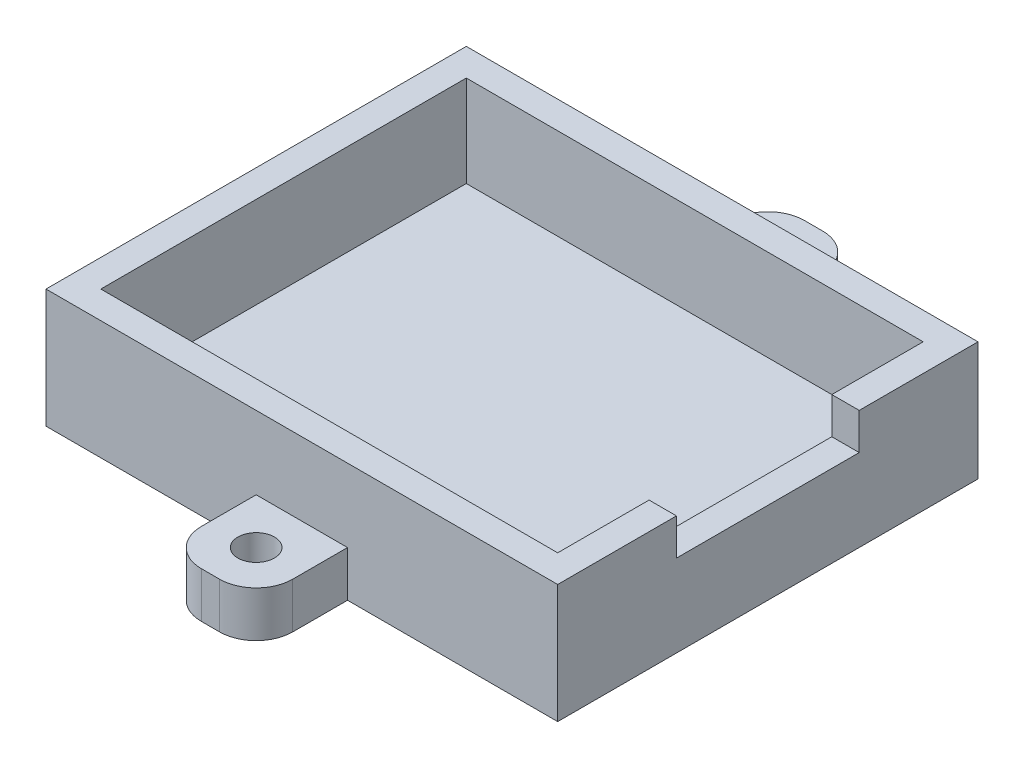
ISO-10303-21;
HEADER;
FILE_DESCRIPTION(('STEP AP214'),'2;1');
FILE_NAME('part.step','',(''),(''),'','','');
FILE_SCHEMA(('AUTOMOTIVE_DESIGN { 1 0 10303 214 1 1 1 1 }'));
ENDSEC;
DATA;
#1=APPLICATION_CONTEXT('core data for automotive mechanical design processes');
#2=APPLICATION_PROTOCOL_DEFINITION('international standard','automotive_design',2000,#1);
#3=PRODUCT_CONTEXT('',#1,'mechanical');
#4=PRODUCT('Part','Part','',(#3));
#5=PRODUCT_RELATED_PRODUCT_CATEGORY('part','',(#4));
#6=PRODUCT_DEFINITION_FORMATION('','',#4);
#7=PRODUCT_DEFINITION_CONTEXT('part definition',#1,'design');
#8=PRODUCT_DEFINITION('design','',#6,#7);
#9=PRODUCT_DEFINITION_SHAPE('','',#8);
#10=(LENGTH_UNIT() NAMED_UNIT(*) SI_UNIT(.MILLI.,.METRE.));
#11=(NAMED_UNIT(*) PLANE_ANGLE_UNIT() SI_UNIT($,.RADIAN.));
#12=(NAMED_UNIT(*) SI_UNIT($,.STERADIAN.) SOLID_ANGLE_UNIT());
#13=UNCERTAINTY_MEASURE_WITH_UNIT(LENGTH_MEASURE(1.E-05),#10,'distance_accuracy_value','');
#14=(GEOMETRIC_REPRESENTATION_CONTEXT(3) GLOBAL_UNCERTAINTY_ASSIGNED_CONTEXT((#13)) GLOBAL_UNIT_ASSIGNED_CONTEXT((#10,
#11,#12)) REPRESENTATION_CONTEXT('',''));
#15=CARTESIAN_POINT('',(0.,0.,0.));
#16=DIRECTION('',(0.,0.,1.));
#17=DIRECTION('',(1.,0.,0.));
#18=AXIS2_PLACEMENT_3D('',#15,#16,#17);
#19=CARTESIAN_POINT('',(0.,1.5,0.));
#20=DIRECTION('',(1.,0.,0.));
#21=DIRECTION('',(0.,0.,-1.));
#22=AXIS2_PLACEMENT_3D('',#19,#20,#21);
#23=PLANE('',#22);
#24=DIRECTION('',(0.,0.,1.));
#25=VECTOR('',#24,1.);
#26=CARTESIAN_POINT('',(0.,0.,0.));
#27=LINE('',#26,#25);
#28=CARTESIAN_POINT('',(0.,0.,0.));
#29=VERTEX_POINT('',#28);
#30=CARTESIAN_POINT('',(0.,0.,23.));
#31=VERTEX_POINT('',#30);
#32=EDGE_CURVE('E207',#29,#31,#27,.T.);
#33=ORIENTED_EDGE('',*,*,#32,.T.);
#34=DIRECTION('',(0.,-1.,0.));
#35=VECTOR('',#34,1.);
#36=CARTESIAN_POINT('',(0.,1.5,23.));
#37=LINE('',#36,#35);
#38=CARTESIAN_POINT('',(0.,6.5,23.));
#39=VERTEX_POINT('',#38);
#40=EDGE_CURVE('E324',#39,#31,#37,.T.);
#41=ORIENTED_EDGE('',*,*,#40,.F.);
#42=DIRECTION('',(0.,0.,1.));
#43=VECTOR('',#42,1.);
#44=CARTESIAN_POINT('',(0.,6.5,23.));
#45=LINE('',#44,#43);
#46=CARTESIAN_POINT('',(0.,6.5,0.));
#47=VERTEX_POINT('',#46);
#48=EDGE_CURVE('E296',#47,#39,#45,.T.);
#49=ORIENTED_EDGE('',*,*,#48,.F.);
#50=DIRECTION('',(0.,-1.,0.));
#51=VECTOR('',#50,1.);
#52=CARTESIAN_POINT('',(0.,1.5,0.));
#53=LINE('',#52,#51);
#54=EDGE_CURVE('E316',#47,#29,#53,.T.);
#55=ORIENTED_EDGE('',*,*,#54,.T.);
#56=EDGE_LOOP('',(#33,#41,#49,#55));
#57=FACE_BOUND('',#56,.T.);
#58=ADVANCED_FACE('F35',(#57),#23,.F.);
#59=CARTESIAN_POINT('',(0.,1.5,23.));
#60=DIRECTION('',(0.,0.,-1.));
#61=DIRECTION('',(-1.,0.,0.));
#62=AXIS2_PLACEMENT_3D('',#59,#60,#61);
#63=PLANE('',#62);
#64=DIRECTION('',(1.,0.,0.));
#65=VECTOR('',#64,1.);
#66=CARTESIAN_POINT('',(0.,0.,23.));
#67=LINE('',#66,#65);
#68=CARTESIAN_POINT('',(11.5,0.,23.));
#69=VERTEX_POINT('',#68);
#70=EDGE_CURVE('E206',#31,#69,#67,.T.);
#71=ORIENTED_EDGE('',*,*,#70,.T.);
#72=DIRECTION('',(0.,1.,0.));
#73=VECTOR('',#72,1.);
#74=CARTESIAN_POINT('',(11.5,1.5,23.));
#75=LINE('',#74,#73);
#76=CARTESIAN_POINT('',(11.5,2.5,23.));
#77=VERTEX_POINT('',#76);
#78=EDGE_CURVE('E242',#69,#77,#75,.T.);
#79=ORIENTED_EDGE('',*,*,#78,.T.);
#80=DIRECTION('',(-1.,0.,0.));
#81=VECTOR('',#80,1.);
#82=CARTESIAN_POINT('',(0.,2.5,23.));
#83=LINE('',#82,#81);
#84=CARTESIAN_POINT('',(16.5,2.5,23.));
#85=VERTEX_POINT('',#84);
#86=EDGE_CURVE('E215',#85,#77,#83,.T.);
#87=ORIENTED_EDGE('',*,*,#86,.F.);
#88=DIRECTION('',(0.,-1.,0.));
#89=VECTOR('',#88,1.);
#90=CARTESIAN_POINT('',(16.5,1.5,23.));
#91=LINE('',#90,#89);
#92=CARTESIAN_POINT('',(16.5,0.,23.));
#93=VERTEX_POINT('',#92);
#94=EDGE_CURVE('E210',#85,#93,#91,.T.);
#95=ORIENTED_EDGE('',*,*,#94,.T.);
#96=CARTESIAN_POINT('',(28.,0.,23.));
#97=VERTEX_POINT('',#96);
#98=EDGE_CURVE('E196',#93,#97,#67,.T.);
#99=ORIENTED_EDGE('',*,*,#98,.T.);
#100=DIRECTION('',(0.,-1.,0.));
#101=VECTOR('',#100,1.);
#102=CARTESIAN_POINT('',(28.,1.5,23.));
#103=LINE('',#102,#101);
#104=CARTESIAN_POINT('',(28.,6.5,23.));
#105=VERTEX_POINT('',#104);
#106=EDGE_CURVE('E322',#105,#97,#103,.T.);
#107=ORIENTED_EDGE('',*,*,#106,.F.);
#108=DIRECTION('',(1.,0.,0.));
#109=VECTOR('',#108,1.);
#110=CARTESIAN_POINT('',(0.,6.5,23.));
#111=LINE('',#110,#109);
#112=EDGE_CURVE('E299',#39,#105,#111,.T.);
#113=ORIENTED_EDGE('',*,*,#112,.F.);
#114=ORIENTED_EDGE('',*,*,#40,.T.);
#115=EDGE_LOOP('',(#71,#79,#87,#95,#99,#107,#113,#114));
#116=FACE_BOUND('',#115,.T.);
#117=ADVANCED_FACE('F212',(#116),#63,.F.);
#118=CARTESIAN_POINT('',(28.,1.5,0.));
#119=DIRECTION('',(-1.,0.,0.));
#120=DIRECTION('',(0.,0.,1.));
#121=AXIS2_PLACEMENT_3D('',#118,#119,#120);
#122=PLANE('',#121);
#123=DIRECTION('',(0.,0.,-1.));
#124=VECTOR('',#123,1.);
#125=CARTESIAN_POINT('',(28.,4.5,16.5));
#126=LINE('',#125,#124);
#127=CARTESIAN_POINT('',(28.,4.5,16.5));
#128=VERTEX_POINT('',#127);
#129=CARTESIAN_POINT('',(28.,4.5,6.5));
#130=VERTEX_POINT('',#129);
#131=EDGE_CURVE('E251',#128,#130,#126,.T.);
#132=ORIENTED_EDGE('',*,*,#131,.F.);
#133=DIRECTION('',(0.,-1.,0.));
#134=VECTOR('',#133,1.);
#135=CARTESIAN_POINT('',(28.,6.5,16.5));
#136=LINE('',#135,#134);
#137=CARTESIAN_POINT('',(28.,6.5,16.5));
#138=VERTEX_POINT('',#137);
#139=EDGE_CURVE('E248',#138,#128,#136,.T.);
#140=ORIENTED_EDGE('',*,*,#139,.F.);
#141=DIRECTION('',(0.,0.,-1.));
#142=VECTOR('',#141,1.);
#143=CARTESIAN_POINT('',(28.,6.5,23.));
#144=LINE('',#143,#142);
#145=EDGE_CURVE('E303',#105,#138,#144,.T.);
#146=ORIENTED_EDGE('',*,*,#145,.F.);
#147=ORIENTED_EDGE('',*,*,#106,.T.);
#148=DIRECTION('',(0.,0.,-1.));
#149=VECTOR('',#148,1.);
#150=CARTESIAN_POINT('',(28.,0.,0.));
#151=LINE('',#150,#149);
#152=CARTESIAN_POINT('',(28.,0.,0.));
#153=VERTEX_POINT('',#152);
#154=EDGE_CURVE('E203',#97,#153,#151,.T.);
#155=ORIENTED_EDGE('',*,*,#154,.T.);
#156=DIRECTION('',(0.,-1.,0.));
#157=VECTOR('',#156,1.);
#158=CARTESIAN_POINT('',(28.,1.5,0.));
#159=LINE('',#158,#157);
#160=CARTESIAN_POINT('',(28.,6.5,0.));
#161=VERTEX_POINT('',#160);
#162=EDGE_CURVE('E319',#161,#153,#159,.T.);
#163=ORIENTED_EDGE('',*,*,#162,.F.);
#164=CARTESIAN_POINT('',(28.,6.5,6.5));
#165=VERTEX_POINT('',#164);
#166=EDGE_CURVE('E302',#165,#161,#144,.T.);
#167=ORIENTED_EDGE('',*,*,#166,.F.);
#168=DIRECTION('',(0.,1.,0.));
#169=VECTOR('',#168,1.);
#170=CARTESIAN_POINT('',(28.,6.5,6.5));
#171=LINE('',#170,#169);
#172=EDGE_CURVE('E254',#130,#165,#171,.T.);
#173=ORIENTED_EDGE('',*,*,#172,.F.);
#174=EDGE_LOOP('',(#132,#140,#146,#147,#155,#163,#167,#173));
#175=FACE_BOUND('',#174,.T.);
#176=ADVANCED_FACE('F432',(#175),#122,.F.);
#177=CARTESIAN_POINT('',(0.,1.5,0.));
#178=DIRECTION('',(0.,0.,1.));
#179=DIRECTION('',(1.,0.,0.));
#180=AXIS2_PLACEMENT_3D('',#177,#178,#179);
#181=PLANE('',#180);
#182=DIRECTION('',(1.,0.,0.));
#183=VECTOR('',#182,1.);
#184=CARTESIAN_POINT('',(0.,2.5,0.));
#185=LINE('',#184,#183);
#186=CARTESIAN_POINT('',(11.5,2.5,0.));
#187=VERTEX_POINT('',#186);
#188=CARTESIAN_POINT('',(16.5,2.5,0.));
#189=VERTEX_POINT('',#188);
#190=EDGE_CURVE('E244',#187,#189,#185,.T.);
#191=ORIENTED_EDGE('',*,*,#190,.F.);
#192=DIRECTION('',(0.,-1.,0.));
#193=VECTOR('',#192,1.);
#194=CARTESIAN_POINT('',(11.5,1.5,0.));
#195=LINE('',#194,#193);
#196=CARTESIAN_POINT('',(11.5,0.,0.));
#197=VERTEX_POINT('',#196);
#198=EDGE_CURVE('E219',#187,#197,#195,.T.);
#199=ORIENTED_EDGE('',*,*,#198,.T.);
#200=DIRECTION('',(-1.,0.,0.));
#201=VECTOR('',#200,1.);
#202=CARTESIAN_POINT('',(0.,0.,0.));
#203=LINE('',#202,#201);
#204=EDGE_CURVE('E312',#197,#29,#203,.T.);
#205=ORIENTED_EDGE('',*,*,#204,.T.);
#206=ORIENTED_EDGE('',*,*,#54,.F.);
#207=DIRECTION('',(-1.,0.,0.));
#208=VECTOR('',#207,1.);
#209=CARTESIAN_POINT('',(0.,6.5,0.));
#210=LINE('',#209,#208);
#211=EDGE_CURVE('E306',#161,#47,#210,.T.);
#212=ORIENTED_EDGE('',*,*,#211,.F.);
#213=ORIENTED_EDGE('',*,*,#162,.T.);
#214=CARTESIAN_POINT('',(16.5,0.,0.));
#215=VERTEX_POINT('',#214);
#216=EDGE_CURVE('E313',#153,#215,#203,.T.);
#217=ORIENTED_EDGE('',*,*,#216,.T.);
#218=DIRECTION('',(0.,1.,0.));
#219=VECTOR('',#218,1.);
#220=CARTESIAN_POINT('',(16.5,1.5,0.));
#221=LINE('',#220,#219);
#222=EDGE_CURVE('E220',#215,#189,#221,.T.);
#223=ORIENTED_EDGE('',*,*,#222,.T.);
#224=EDGE_LOOP('',(#191,#199,#205,#206,#212,#213,#217,#223));
#225=FACE_BOUND('',#224,.T.);
#226=ADVANCED_FACE('F556',(#225),#181,.F.);
#227=CARTESIAN_POINT('',(0.,0.,0.));
#228=DIRECTION('',(0.,1.,0.));
#229=DIRECTION('',(0.,0.,1.));
#230=AXIS2_PLACEMENT_3D('',#227,#228,#229);
#231=PLANE('',#230);
#232=CARTESIAN_POINT('',(14.,0.,25.5));
#233=DIRECTION('',(0.,1.,0.));
#234=DIRECTION('',(0.,0.,1.));
#235=AXIS2_PLACEMENT_3D('',#232,#233,#234);
#236=CIRCLE('',#235,1.);
#237=CARTESIAN_POINT('',(14.,0.,26.5));
#238=VERTEX_POINT('',#237);
#239=EDGE_CURVE('E390',#238,#238,#236,.T.);
#240=ORIENTED_EDGE('',*,*,#239,.T.);
#241=EDGE_LOOP('',(#240));
#242=FACE_BOUND('',#241,.T.);
#243=CARTESIAN_POINT('',(14.,0.,-2.5));
#244=DIRECTION('',(0.,1.,0.));
#245=DIRECTION('',(0.,0.,1.));
#246=AXIS2_PLACEMENT_3D('',#243,#244,#245);
#247=CIRCLE('',#246,1.);
#248=CARTESIAN_POINT('',(14.,0.,-1.5));
#249=VERTEX_POINT('',#248);
#250=EDGE_CURVE('E380',#249,#249,#247,.T.);
#251=ORIENTED_EDGE('',*,*,#250,.T.);
#252=EDGE_LOOP('',(#251));
#253=FACE_BOUND('',#252,.T.);
#254=DIRECTION('',(1.,0.,0.));
#255=VECTOR('',#254,1.);
#256=CARTESIAN_POINT('',(11.5,0.,-5.));
#257=LINE('',#256,#255);
#258=CARTESIAN_POINT('',(13.5,0.,-5.));
#259=VERTEX_POINT('',#258);
#260=CARTESIAN_POINT('',(14.5,0.,-5.));
#261=VERTEX_POINT('',#260);
#262=EDGE_CURVE('E227',#259,#261,#257,.T.);
#263=ORIENTED_EDGE('',*,*,#262,.T.);
#264=CARTESIAN_POINT('',(14.5,0.,-3.));
#265=DIRECTION('',(0.,1.,0.));
#266=DIRECTION('',(0.,0.,1.));
#267=AXIS2_PLACEMENT_3D('',#264,#265,#266);
#268=CIRCLE('',#267,2.);
#269=CARTESIAN_POINT('',(16.5,0.,-3.));
#270=VERTEX_POINT('',#269);
#271=EDGE_CURVE('E345',#261,#270,#268,.F.);
#272=ORIENTED_EDGE('',*,*,#271,.T.);
#273=DIRECTION('',(0.,0.,1.));
#274=VECTOR('',#273,1.);
#275=CARTESIAN_POINT('',(16.5,0.,28.));
#276=LINE('',#275,#274);
#277=EDGE_CURVE('E226',#270,#215,#276,.T.);
#278=ORIENTED_EDGE('',*,*,#277,.T.);
#279=ORIENTED_EDGE('',*,*,#216,.F.);
#280=ORIENTED_EDGE('',*,*,#154,.F.);
#281=ORIENTED_EDGE('',*,*,#98,.F.);
#282=CARTESIAN_POINT('',(16.5,0.,26.));
#283=VERTEX_POINT('',#282);
#284=EDGE_CURVE('E201',#93,#283,#276,.T.);
#285=ORIENTED_EDGE('',*,*,#284,.T.);
#286=CARTESIAN_POINT('',(14.5,0.,26.));
#287=DIRECTION('',(0.,1.,0.));
#288=DIRECTION('',(0.,0.,1.));
#289=AXIS2_PLACEMENT_3D('',#286,#287,#288);
#290=CIRCLE('',#289,2.);
#291=CARTESIAN_POINT('',(14.5,0.,28.));
#292=VERTEX_POINT('',#291);
#293=EDGE_CURVE('E341',#283,#292,#290,.F.);
#294=ORIENTED_EDGE('',*,*,#293,.T.);
#295=DIRECTION('',(-1.,0.,0.));
#296=VECTOR('',#295,1.);
#297=CARTESIAN_POINT('',(11.5,0.,28.));
#298=LINE('',#297,#296);
#299=CARTESIAN_POINT('',(13.5,0.,28.));
#300=VERTEX_POINT('',#299);
#301=EDGE_CURVE('E229',#292,#300,#298,.T.);
#302=ORIENTED_EDGE('',*,*,#301,.T.);
#303=CARTESIAN_POINT('',(13.5,0.,26.));
#304=DIRECTION('',(0.,1.,0.));
#305=DIRECTION('',(0.,0.,1.));
#306=AXIS2_PLACEMENT_3D('',#303,#304,#305);
#307=CIRCLE('',#306,2.);
#308=CARTESIAN_POINT('',(11.5,0.,26.));
#309=VERTEX_POINT('',#308);
#310=EDGE_CURVE('E339',#300,#309,#307,.F.);
#311=ORIENTED_EDGE('',*,*,#310,.T.);
#312=DIRECTION('',(0.,0.,-1.));
#313=VECTOR('',#312,1.);
#314=CARTESIAN_POINT('',(11.5,0.,28.));
#315=LINE('',#314,#313);
#316=EDGE_CURVE('E230',#309,#69,#315,.T.);
#317=ORIENTED_EDGE('',*,*,#316,.T.);
#318=ORIENTED_EDGE('',*,*,#70,.F.);
#319=ORIENTED_EDGE('',*,*,#32,.F.);
#320=ORIENTED_EDGE('',*,*,#204,.F.);
#321=CARTESIAN_POINT('',(11.5,0.,-3.));
#322=VERTEX_POINT('',#321);
#323=EDGE_CURVE('E378',#197,#322,#315,.T.);
#324=ORIENTED_EDGE('',*,*,#323,.T.);
#325=CARTESIAN_POINT('',(13.5,0.,-3.));
#326=DIRECTION('',(0.,1.,0.));
#327=DIRECTION('',(0.,0.,1.));
#328=AXIS2_PLACEMENT_3D('',#325,#326,#327);
#329=CIRCLE('',#328,2.);
#330=EDGE_CURVE('E343',#322,#259,#329,.F.);
#331=ORIENTED_EDGE('',*,*,#330,.T.);
#332=EDGE_LOOP('',(#263,#272,#278,#279,#280,#281,#285,#294,#302,#311,#317,#318,#319,#320,#324,#331));
#333=FACE_BOUND('',#332,.T.);
#334=ADVANCED_FACE('F199',(#242,#253,#333),#231,.F.);
#335=CARTESIAN_POINT('',(0.,6.5,0.));
#336=DIRECTION('',(0.,-1.,0.));
#337=DIRECTION('',(0.,0.,-1.));
#338=AXIS2_PLACEMENT_3D('',#335,#336,#337);
#339=PLANE('',#338);
#340=ORIENTED_EDGE('',*,*,#145,.T.);
#341=DIRECTION('',(1.,0.,0.));
#342=VECTOR('',#341,1.);
#343=CARTESIAN_POINT('',(26.,6.5,16.5));
#344=LINE('',#343,#342);
#345=CARTESIAN_POINT('',(26.5,6.5,16.5));
#346=VERTEX_POINT('',#345);
#347=EDGE_CURVE('E257',#346,#138,#344,.T.);
#348=ORIENTED_EDGE('',*,*,#347,.F.);
#349=DIRECTION('',(0.,0.,-1.));
#350=VECTOR('',#349,1.);
#351=CARTESIAN_POINT('',(26.5,6.5,21.5));
#352=LINE('',#351,#350);
#353=CARTESIAN_POINT('',(26.5,6.5,21.5));
#354=VERTEX_POINT('',#353);
#355=EDGE_CURVE('E270',#354,#346,#352,.T.);
#356=ORIENTED_EDGE('',*,*,#355,.F.);
#357=DIRECTION('',(1.,0.,0.));
#358=VECTOR('',#357,1.);
#359=CARTESIAN_POINT('',(1.50000000000001,6.5,21.5));
#360=LINE('',#359,#358);
#361=CARTESIAN_POINT('',(1.50000000000001,6.5,21.5));
#362=VERTEX_POINT('',#361);
#363=EDGE_CURVE('E266',#362,#354,#360,.T.);
#364=ORIENTED_EDGE('',*,*,#363,.F.);
#365=DIRECTION('',(0.,0.,1.));
#366=VECTOR('',#365,1.);
#367=CARTESIAN_POINT('',(1.50000000000001,6.5,21.5));
#368=LINE('',#367,#366);
#369=CARTESIAN_POINT('',(1.50000000000001,6.5,1.5));
#370=VERTEX_POINT('',#369);
#371=EDGE_CURVE('E276',#370,#362,#368,.T.);
#372=ORIENTED_EDGE('',*,*,#371,.F.);
#373=DIRECTION('',(-1.,0.,0.));
#374=VECTOR('',#373,1.);
#375=CARTESIAN_POINT('',(1.50000000000001,6.5,1.5));
#376=LINE('',#375,#374);
#377=CARTESIAN_POINT('',(26.5,6.5,1.5));
#378=VERTEX_POINT('',#377);
#379=EDGE_CURVE('E273',#378,#370,#376,.T.);
#380=ORIENTED_EDGE('',*,*,#379,.F.);
#381=CARTESIAN_POINT('',(26.5,6.5,6.5));
#382=VERTEX_POINT('',#381);
#383=EDGE_CURVE('E268',#382,#378,#352,.T.);
#384=ORIENTED_EDGE('',*,*,#383,.F.);
#385=DIRECTION('',(1.,0.,0.));
#386=VECTOR('',#385,1.);
#387=CARTESIAN_POINT('',(26.,6.5,6.5));
#388=LINE('',#387,#386);
#389=EDGE_CURVE('E260',#382,#165,#388,.T.);
#390=ORIENTED_EDGE('',*,*,#389,.T.);
#391=ORIENTED_EDGE('',*,*,#166,.T.);
#392=ORIENTED_EDGE('',*,*,#211,.T.);
#393=ORIENTED_EDGE('',*,*,#48,.T.);
#394=ORIENTED_EDGE('',*,*,#112,.T.);
#395=EDGE_LOOP('',(#340,#348,#356,#364,#372,#380,#384,#390,#391,#392,#393,#394));
#396=FACE_BOUND('',#395,.T.);
#397=ADVANCED_FACE('F548',(#396),#339,.F.);
#398=CARTESIAN_POINT('',(1.50000000000001,6.5,21.5));
#399=DIRECTION('',(0.,0.,-1.));
#400=DIRECTION('',(-1.,0.,0.));
#401=AXIS2_PLACEMENT_3D('',#398,#399,#400);
#402=PLANE('',#401);
#403=DIRECTION('',(0.,-1.,0.));
#404=VECTOR('',#403,1.);
#405=CARTESIAN_POINT('',(26.5,6.5,21.5));
#406=LINE('',#405,#404);
#407=CARTESIAN_POINT('',(26.5,1.5,21.5));
#408=VERTEX_POINT('',#407);
#409=EDGE_CURVE('E293',#354,#408,#406,.T.);
#410=ORIENTED_EDGE('',*,*,#409,.T.);
#411=DIRECTION('',(1.,0.,0.));
#412=VECTOR('',#411,1.);
#413=CARTESIAN_POINT('',(1.50000000000001,1.5,21.5));
#414=LINE('',#413,#412);
#415=CARTESIAN_POINT('',(1.50000000000001,1.5,21.5));
#416=VERTEX_POINT('',#415);
#417=EDGE_CURVE('E259',#416,#408,#414,.T.);
#418=ORIENTED_EDGE('',*,*,#417,.F.);
#419=DIRECTION('',(0.,-1.,0.));
#420=VECTOR('',#419,1.);
#421=CARTESIAN_POINT('',(1.50000000000001,6.5,21.5));
#422=LINE('',#421,#420);
#423=EDGE_CURVE('E278',#362,#416,#422,.T.);
#424=ORIENTED_EDGE('',*,*,#423,.F.);
#425=ORIENTED_EDGE('',*,*,#363,.T.);
#426=EDGE_LOOP('',(#410,#418,#424,#425));
#427=FACE_BOUND('',#426,.T.);
#428=ADVANCED_FACE('F545',(#427),#402,.T.);
#429=CARTESIAN_POINT('',(26.5,6.5,21.5));
#430=DIRECTION('',(-1.,0.,0.));
#431=DIRECTION('',(0.,0.,1.));
#432=AXIS2_PLACEMENT_3D('',#429,#430,#431);
#433=PLANE('',#432);
#434=DIRECTION('',(0.,1.,0.));
#435=VECTOR('',#434,1.);
#436=CARTESIAN_POINT('',(26.5,6.5,16.5));
#437=LINE('',#436,#435);
#438=CARTESIAN_POINT('',(26.5,4.5,16.5));
#439=VERTEX_POINT('',#438);
#440=EDGE_CURVE('E332',#439,#346,#437,.T.);
#441=ORIENTED_EDGE('',*,*,#440,.F.);
#442=DIRECTION('',(0.,0.,1.));
#443=VECTOR('',#442,1.);
#444=CARTESIAN_POINT('',(26.5,4.5,21.5));
#445=LINE('',#444,#443);
#446=CARTESIAN_POINT('',(26.5,4.5,6.5));
#447=VERTEX_POINT('',#446);
#448=EDGE_CURVE('E327',#447,#439,#445,.T.);
#449=ORIENTED_EDGE('',*,*,#448,.F.);
#450=DIRECTION('',(0.,-1.,0.));
#451=VECTOR('',#450,1.);
#452=CARTESIAN_POINT('',(26.5,6.5,6.5));
#453=LINE('',#452,#451);
#454=EDGE_CURVE('E329',#382,#447,#453,.T.);
#455=ORIENTED_EDGE('',*,*,#454,.F.);
#456=ORIENTED_EDGE('',*,*,#383,.T.);
#457=DIRECTION('',(0.,-1.,0.));
#458=VECTOR('',#457,1.);
#459=CARTESIAN_POINT('',(26.5,6.5,1.5));
#460=LINE('',#459,#458);
#461=CARTESIAN_POINT('',(26.5,1.5,1.5));
#462=VERTEX_POINT('',#461);
#463=EDGE_CURVE('E290',#378,#462,#460,.T.);
#464=ORIENTED_EDGE('',*,*,#463,.T.);
#465=DIRECTION('',(0.,0.,-1.));
#466=VECTOR('',#465,1.);
#467=CARTESIAN_POINT('',(26.5,1.5,21.5));
#468=LINE('',#467,#466);
#469=EDGE_CURVE('E280',#408,#462,#468,.T.);
#470=ORIENTED_EDGE('',*,*,#469,.F.);
#471=ORIENTED_EDGE('',*,*,#409,.F.);
#472=ORIENTED_EDGE('',*,*,#355,.T.);
#473=EDGE_LOOP('',(#441,#449,#455,#456,#464,#470,#471,#472));
#474=FACE_BOUND('',#473,.T.);
#475=ADVANCED_FACE('F539',(#474),#433,.T.);
#476=CARTESIAN_POINT('',(1.50000000000001,6.5,1.5));
#477=DIRECTION('',(0.,0.,1.));
#478=DIRECTION('',(1.,0.,0.));
#479=AXIS2_PLACEMENT_3D('',#476,#477,#478);
#480=PLANE('',#479);
#481=DIRECTION('',(0.,-1.,0.));
#482=VECTOR('',#481,1.);
#483=CARTESIAN_POINT('',(1.50000000000001,6.5,1.5));
#484=LINE('',#483,#482);
#485=CARTESIAN_POINT('',(1.50000000000001,1.5,1.5));
#486=VERTEX_POINT('',#485);
#487=EDGE_CURVE('E287',#370,#486,#484,.T.);
#488=ORIENTED_EDGE('',*,*,#487,.T.);
#489=DIRECTION('',(-1.,0.,0.));
#490=VECTOR('',#489,1.);
#491=CARTESIAN_POINT('',(1.50000000000001,1.5,1.5));
#492=LINE('',#491,#490);
#493=EDGE_CURVE('E282',#462,#486,#492,.T.);
#494=ORIENTED_EDGE('',*,*,#493,.F.);
#495=ORIENTED_EDGE('',*,*,#463,.F.);
#496=ORIENTED_EDGE('',*,*,#379,.T.);
#497=EDGE_LOOP('',(#488,#494,#495,#496));
#498=FACE_BOUND('',#497,.T.);
#499=ADVANCED_FACE('F536',(#498),#480,.T.);
#500=CARTESIAN_POINT('',(1.50000000000001,6.5,21.5));
#501=DIRECTION('',(1.,0.,0.));
#502=DIRECTION('',(0.,0.,-1.));
#503=AXIS2_PLACEMENT_3D('',#500,#501,#502);
#504=PLANE('',#503);
#505=DIRECTION('',(0.,0.,1.));
#506=VECTOR('',#505,1.);
#507=CARTESIAN_POINT('',(1.50000000000001,1.5,21.5));
#508=LINE('',#507,#506);
#509=EDGE_CURVE('E269',#486,#416,#508,.T.);
#510=ORIENTED_EDGE('',*,*,#509,.F.);
#511=ORIENTED_EDGE('',*,*,#487,.F.);
#512=ORIENTED_EDGE('',*,*,#371,.T.);
#513=ORIENTED_EDGE('',*,*,#423,.T.);
#514=EDGE_LOOP('',(#510,#511,#512,#513));
#515=FACE_BOUND('',#514,.T.);
#516=ADVANCED_FACE('F529',(#515),#504,.T.);
#517=CARTESIAN_POINT('',(0.,1.5,0.));
#518=DIRECTION('',(0.,1.,0.));
#519=DIRECTION('',(0.,0.,1.));
#520=AXIS2_PLACEMENT_3D('',#517,#518,#519);
#521=PLANE('',#520);
#522=ORIENTED_EDGE('',*,*,#493,.T.);
#523=ORIENTED_EDGE('',*,*,#509,.T.);
#524=ORIENTED_EDGE('',*,*,#417,.T.);
#525=ORIENTED_EDGE('',*,*,#469,.T.);
#526=EDGE_LOOP('',(#522,#523,#524,#525));
#527=FACE_BOUND('',#526,.T.);
#528=ADVANCED_FACE('F524',(#527),#521,.T.);
#529=CARTESIAN_POINT('',(26.,6.5,16.5));
#530=DIRECTION('',(0.,0.,1.));
#531=DIRECTION('',(1.,0.,0.));
#532=AXIS2_PLACEMENT_3D('',#529,#530,#531);
#533=PLANE('',#532);
#534=ORIENTED_EDGE('',*,*,#440,.T.);
#535=ORIENTED_EDGE('',*,*,#347,.T.);
#536=ORIENTED_EDGE('',*,*,#139,.T.);
#537=DIRECTION('',(1.,0.,0.));
#538=VECTOR('',#537,1.);
#539=CARTESIAN_POINT('',(26.,4.5,16.5));
#540=LINE('',#539,#538);
#541=EDGE_CURVE('E256',#439,#128,#540,.T.);
#542=ORIENTED_EDGE('',*,*,#541,.F.);
#543=EDGE_LOOP('',(#534,#535,#536,#542));
#544=FACE_BOUND('',#543,.T.);
#545=ADVANCED_FACE('F528',(#544),#533,.F.);
#546=CARTESIAN_POINT('',(26.,6.5,6.5));
#547=DIRECTION('',(0.,0.,-1.));
#548=DIRECTION('',(-1.,0.,0.));
#549=AXIS2_PLACEMENT_3D('',#546,#547,#548);
#550=PLANE('',#549);
#551=ORIENTED_EDGE('',*,*,#454,.T.);
#552=DIRECTION('',(1.,0.,0.));
#553=VECTOR('',#552,1.);
#554=CARTESIAN_POINT('',(26.,4.5,6.5));
#555=LINE('',#554,#553);
#556=EDGE_CURVE('E263',#447,#130,#555,.T.);
#557=ORIENTED_EDGE('',*,*,#556,.T.);
#558=ORIENTED_EDGE('',*,*,#172,.T.);
#559=ORIENTED_EDGE('',*,*,#389,.F.);
#560=EDGE_LOOP('',(#551,#557,#558,#559));
#561=FACE_BOUND('',#560,.T.);
#562=ADVANCED_FACE('F567',(#561),#550,.F.);
#563=CARTESIAN_POINT('',(26.,4.5,16.5));
#564=DIRECTION('',(0.,-1.,0.));
#565=DIRECTION('',(0.,0.,-1.));
#566=AXIS2_PLACEMENT_3D('',#563,#564,#565);
#567=PLANE('',#566);
#568=ORIENTED_EDGE('',*,*,#448,.T.);
#569=ORIENTED_EDGE('',*,*,#541,.T.);
#570=ORIENTED_EDGE('',*,*,#131,.T.);
#571=ORIENTED_EDGE('',*,*,#556,.F.);
#572=EDGE_LOOP('',(#568,#569,#570,#571));
#573=FACE_BOUND('',#572,.T.);
#574=ADVANCED_FACE('F516',(#573),#567,.F.);
#575=CARTESIAN_POINT('',(11.5,2.5,-5.));
#576=DIRECTION('',(0.,0.,-1.));
#577=DIRECTION('',(-1.,0.,0.));
#578=AXIS2_PLACEMENT_3D('',#575,#576,#577);
#579=PLANE('',#578);
#580=DIRECTION('',(1.,0.,0.));
#581=VECTOR('',#580,1.);
#582=CARTESIAN_POINT('',(11.5,2.5,-5.));
#583=LINE('',#582,#581);
#584=CARTESIAN_POINT('',(13.5,2.5,-5.));
#585=VERTEX_POINT('',#584);
#586=CARTESIAN_POINT('',(14.5,2.5,-5.));
#587=VERTEX_POINT('',#586);
#588=EDGE_CURVE('E368',#585,#587,#583,.T.);
#589=ORIENTED_EDGE('',*,*,#588,.T.);
#590=DIRECTION('',(0.,-1.,0.));
#591=VECTOR('',#590,1.);
#592=CARTESIAN_POINT('',(14.5,2.5,-5.));
#593=LINE('',#592,#591);
#594=EDGE_CURVE('E336',#587,#261,#593,.T.);
#595=ORIENTED_EDGE('',*,*,#594,.T.);
#596=ORIENTED_EDGE('',*,*,#262,.F.);
#597=DIRECTION('',(0.,-1.,0.));
#598=VECTOR('',#597,1.);
#599=CARTESIAN_POINT('',(13.5,2.5,-5.));
#600=LINE('',#599,#598);
#601=EDGE_CURVE('E334',#259,#585,#600,.F.);
#602=ORIENTED_EDGE('',*,*,#601,.T.);
#603=EDGE_LOOP('',(#589,#595,#596,#602));
#604=FACE_BOUND('',#603,.T.);
#605=ADVANCED_FACE('F423',(#604),#579,.T.);
#606=CARTESIAN_POINT('',(0.,2.5,0.));
#607=DIRECTION('',(0.,-1.,0.));
#608=DIRECTION('',(0.,0.,-1.));
#609=AXIS2_PLACEMENT_3D('',#606,#607,#608);
#610=PLANE('',#609);
#611=CARTESIAN_POINT('',(14.,2.5,-2.5));
#612=DIRECTION('',(0.,1.,0.));
#613=DIRECTION('',(0.,0.,1.));
#614=AXIS2_PLACEMENT_3D('',#611,#612,#613);
#615=CIRCLE('',#614,1.);
#616=CARTESIAN_POINT('',(14.,2.5,-1.5));
#617=VERTEX_POINT('',#616);
#618=EDGE_CURVE('E387',#617,#617,#615,.T.);
#619=ORIENTED_EDGE('',*,*,#618,.F.);
#620=EDGE_LOOP('',(#619));
#621=FACE_BOUND('',#620,.T.);
#622=DIRECTION('',(0.,0.,1.));
#623=VECTOR('',#622,1.);
#624=CARTESIAN_POINT('',(16.5,2.5,28.));
#625=LINE('',#624,#623);
#626=CARTESIAN_POINT('',(16.5,2.5,-3.));
#627=VERTEX_POINT('',#626);
#628=EDGE_CURVE('E367',#627,#189,#625,.T.);
#629=ORIENTED_EDGE('',*,*,#628,.F.);
#630=CARTESIAN_POINT('',(14.5,2.5,-3.));
#631=DIRECTION('',(0.,-1.,0.));
#632=DIRECTION('',(0.,0.,-1.));
#633=AXIS2_PLACEMENT_3D('',#630,#631,#632);
#634=CIRCLE('',#633,2.);
#635=EDGE_CURVE('E351',#627,#587,#634,.F.);
#636=ORIENTED_EDGE('',*,*,#635,.T.);
#637=ORIENTED_EDGE('',*,*,#588,.F.);
#638=CARTESIAN_POINT('',(13.5,2.5,-3.));
#639=DIRECTION('',(0.,-1.,0.));
#640=DIRECTION('',(0.,0.,-1.));
#641=AXIS2_PLACEMENT_3D('',#638,#639,#640);
#642=CIRCLE('',#641,2.);
#643=CARTESIAN_POINT('',(11.5,2.5,-3.));
#644=VERTEX_POINT('',#643);
#645=EDGE_CURVE('E349',#585,#644,#642,.F.);
#646=ORIENTED_EDGE('',*,*,#645,.T.);
#647=DIRECTION('',(0.,0.,-1.));
#648=VECTOR('',#647,1.);
#649=CARTESIAN_POINT('',(11.5,2.5,28.));
#650=LINE('',#649,#648);
#651=EDGE_CURVE('E236',#187,#644,#650,.T.);
#652=ORIENTED_EDGE('',*,*,#651,.F.);
#653=ORIENTED_EDGE('',*,*,#190,.T.);
#654=EDGE_LOOP('',(#629,#636,#637,#646,#652,#653));
#655=FACE_BOUND('',#654,.T.);
#656=ADVANCED_FACE('F412',(#621,#655),#610,.F.);
#657=CARTESIAN_POINT('',(16.5,2.5,28.));
#658=DIRECTION('',(1.,0.,0.));
#659=DIRECTION('',(0.,0.,-1.));
#660=AXIS2_PLACEMENT_3D('',#657,#658,#659);
#661=PLANE('',#660);
#662=ORIENTED_EDGE('',*,*,#277,.F.);
#663=DIRECTION('',(0.,-1.,0.));
#664=VECTOR('',#663,1.);
#665=CARTESIAN_POINT('',(16.5,2.5,-3.));
#666=LINE('',#665,#664);
#667=EDGE_CURVE('E347',#270,#627,#666,.F.);
#668=ORIENTED_EDGE('',*,*,#667,.T.);
#669=ORIENTED_EDGE('',*,*,#628,.T.);
#670=ORIENTED_EDGE('',*,*,#222,.F.);
#671=EDGE_LOOP('',(#662,#668,#669,#670));
#672=FACE_BOUND('',#671,.T.);
#673=ADVANCED_FACE('F418',(#672),#661,.T.);
#674=CARTESIAN_POINT('',(11.5,2.5,28.));
#675=DIRECTION('',(-1.,0.,0.));
#676=DIRECTION('',(0.,0.,1.));
#677=AXIS2_PLACEMENT_3D('',#674,#675,#676);
#678=PLANE('',#677);
#679=ORIENTED_EDGE('',*,*,#651,.T.);
#680=DIRECTION('',(0.,-1.,0.));
#681=VECTOR('',#680,1.);
#682=CARTESIAN_POINT('',(11.5,2.5,-3.));
#683=LINE('',#682,#681);
#684=EDGE_CURVE('E353',#644,#322,#683,.T.);
#685=ORIENTED_EDGE('',*,*,#684,.T.);
#686=ORIENTED_EDGE('',*,*,#323,.F.);
#687=ORIENTED_EDGE('',*,*,#198,.F.);
#688=EDGE_LOOP('',(#679,#685,#686,#687));
#689=FACE_BOUND('',#688,.T.);
#690=ADVANCED_FACE('F410',(#689),#678,.T.);
#691=CARTESIAN_POINT('',(14.,2.5,25.5));
#692=DIRECTION('',(0.,1.,0.));
#693=DIRECTION('',(0.,0.,1.));
#694=AXIS2_PLACEMENT_3D('',#691,#692,#693);
#695=CIRCLE('',#694,1.);
#696=CARTESIAN_POINT('',(14.,2.5,26.5));
#697=VERTEX_POINT('',#696);
#698=EDGE_CURVE('E393',#697,#697,#695,.T.);
#699=ORIENTED_EDGE('',*,*,#698,.F.);
#700=EDGE_LOOP('',(#699));
#701=FACE_BOUND('',#700,.T.);
#702=DIRECTION('',(-1.,0.,0.));
#703=VECTOR('',#702,1.);
#704=CARTESIAN_POINT('',(11.5,2.5,28.));
#705=LINE('',#704,#703);
#706=CARTESIAN_POINT('',(14.5,2.5,28.));
#707=VERTEX_POINT('',#706);
#708=CARTESIAN_POINT('',(13.5,2.5,28.));
#709=VERTEX_POINT('',#708);
#710=EDGE_CURVE('E238',#707,#709,#705,.T.);
#711=ORIENTED_EDGE('',*,*,#710,.F.);
#712=CARTESIAN_POINT('',(14.5,2.5,26.));
#713=DIRECTION('',(0.,-1.,0.));
#714=DIRECTION('',(0.,0.,-1.));
#715=AXIS2_PLACEMENT_3D('',#712,#713,#714);
#716=CIRCLE('',#715,2.);
#717=CARTESIAN_POINT('',(16.5,2.5,26.));
#718=VERTEX_POINT('',#717);
#719=EDGE_CURVE('E43',#707,#718,#716,.F.);
#720=ORIENTED_EDGE('',*,*,#719,.T.);
#721=EDGE_CURVE('E364',#85,#718,#625,.T.);
#722=ORIENTED_EDGE('',*,*,#721,.F.);
#723=ORIENTED_EDGE('',*,*,#86,.T.);
#724=CARTESIAN_POINT('',(11.5,2.5,26.));
#725=VERTEX_POINT('',#724);
#726=EDGE_CURVE('E385',#725,#77,#650,.T.);
#727=ORIENTED_EDGE('',*,*,#726,.F.);
#728=CARTESIAN_POINT('',(13.5,2.5,26.));
#729=DIRECTION('',(0.,-1.,0.));
#730=DIRECTION('',(0.,0.,-1.));
#731=AXIS2_PLACEMENT_3D('',#728,#729,#730);
#732=CIRCLE('',#731,2.);
#733=EDGE_CURVE('E55',#725,#709,#732,.F.);
#734=ORIENTED_EDGE('',*,*,#733,.T.);
#735=EDGE_LOOP('',(#711,#720,#722,#723,#727,#734));
#736=FACE_BOUND('',#735,.T.);
#737=ADVANCED_FACE('F363',(#701,#736),#610,.F.);
#738=ORIENTED_EDGE('',*,*,#316,.F.);
#739=DIRECTION('',(0.,-1.,0.));
#740=VECTOR('',#739,1.);
#741=CARTESIAN_POINT('',(11.5,2.5,26.));
#742=LINE('',#741,#740);
#743=EDGE_CURVE('E11',#309,#725,#742,.F.);
#744=ORIENTED_EDGE('',*,*,#743,.T.);
#745=ORIENTED_EDGE('',*,*,#726,.T.);
#746=ORIENTED_EDGE('',*,*,#78,.F.);
#747=EDGE_LOOP('',(#738,#744,#745,#746));
#748=FACE_BOUND('',#747,.T.);
#749=ADVANCED_FACE('F377',(#748),#678,.T.);
#750=ORIENTED_EDGE('',*,*,#721,.T.);
#751=DIRECTION('',(0.,-1.,0.));
#752=VECTOR('',#751,1.);
#753=CARTESIAN_POINT('',(16.5,2.5,26.));
#754=LINE('',#753,#752);
#755=EDGE_CURVE('E225',#718,#283,#754,.T.);
#756=ORIENTED_EDGE('',*,*,#755,.T.);
#757=ORIENTED_EDGE('',*,*,#284,.F.);
#758=ORIENTED_EDGE('',*,*,#94,.F.);
#759=EDGE_LOOP('',(#750,#756,#757,#758));
#760=FACE_BOUND('',#759,.T.);
#761=ADVANCED_FACE('F223',(#760),#661,.T.);
#762=CARTESIAN_POINT('',(11.5,2.5,28.));
#763=DIRECTION('',(0.,0.,1.));
#764=DIRECTION('',(1.,0.,0.));
#765=AXIS2_PLACEMENT_3D('',#762,#763,#764);
#766=PLANE('',#765);
#767=ORIENTED_EDGE('',*,*,#301,.F.);
#768=DIRECTION('',(0.,-1.,0.));
#769=VECTOR('',#768,1.);
#770=CARTESIAN_POINT('',(14.5,2.5,28.));
#771=LINE('',#770,#769);
#772=EDGE_CURVE('E360',#292,#707,#771,.F.);
#773=ORIENTED_EDGE('',*,*,#772,.T.);
#774=ORIENTED_EDGE('',*,*,#710,.T.);
#775=DIRECTION('',(0.,-1.,0.));
#776=VECTOR('',#775,1.);
#777=CARTESIAN_POINT('',(13.5,2.5,28.));
#778=LINE('',#777,#776);
#779=EDGE_CURVE('E357',#709,#300,#778,.T.);
#780=ORIENTED_EDGE('',*,*,#779,.T.);
#781=EDGE_LOOP('',(#767,#773,#774,#780));
#782=FACE_BOUND('',#781,.T.);
#783=ADVANCED_FACE('F373',(#782),#766,.T.);
#784=CARTESIAN_POINT('',(14.,0.,-2.5));
#785=DIRECTION('',(0.,1.,0.));
#786=DIRECTION('',(0.,0.,1.));
#787=AXIS2_PLACEMENT_3D('',#784,#785,#786);
#788=CYLINDRICAL_SURFACE('',#787,1.);
#789=ORIENTED_EDGE('',*,*,#250,.F.);
#790=EDGE_LOOP('',(#789));
#791=FACE_BOUND('',#790,.T.);
#792=ORIENTED_EDGE('',*,*,#618,.T.);
#793=EDGE_LOOP('',(#792));
#794=FACE_BOUND('',#793,.T.);
#795=ADVANCED_FACE('F405',(#791,#794),#788,.F.);
#796=CARTESIAN_POINT('',(14.,0.,25.5));
#797=DIRECTION('',(0.,1.,0.));
#798=DIRECTION('',(0.,0.,1.));
#799=AXIS2_PLACEMENT_3D('',#796,#797,#798);
#800=CYLINDRICAL_SURFACE('',#799,1.);
#801=ORIENTED_EDGE('',*,*,#239,.F.);
#802=EDGE_LOOP('',(#801));
#803=FACE_BOUND('',#802,.T.);
#804=ORIENTED_EDGE('',*,*,#698,.T.);
#805=EDGE_LOOP('',(#804));
#806=FACE_BOUND('',#805,.T.);
#807=ADVANCED_FACE('F401',(#803,#806),#800,.F.);
#808=CARTESIAN_POINT('',(14.5,2.5,-3.));
#809=DIRECTION('',(0.,-1.,0.));
#810=DIRECTION('',(0.,0.,-1.));
#811=AXIS2_PLACEMENT_3D('',#808,#809,#810);
#812=CYLINDRICAL_SURFACE('',#811,2.);
#813=ORIENTED_EDGE('',*,*,#635,.F.);
#814=ORIENTED_EDGE('',*,*,#667,.F.);
#815=ORIENTED_EDGE('',*,*,#271,.F.);
#816=ORIENTED_EDGE('',*,*,#594,.F.);
#817=EDGE_LOOP('',(#813,#814,#815,#816));
#818=FACE_BOUND('',#817,.T.);
#819=ADVANCED_FACE('F404',(#818),#812,.T.);
#820=CARTESIAN_POINT('',(13.5,2.5,-3.));
#821=DIRECTION('',(0.,-1.,0.));
#822=DIRECTION('',(0.,0.,-1.));
#823=AXIS2_PLACEMENT_3D('',#820,#821,#822);
#824=CYLINDRICAL_SURFACE('',#823,2.);
#825=ORIENTED_EDGE('',*,*,#645,.F.);
#826=ORIENTED_EDGE('',*,*,#601,.F.);
#827=ORIENTED_EDGE('',*,*,#330,.F.);
#828=ORIENTED_EDGE('',*,*,#684,.F.);
#829=EDGE_LOOP('',(#825,#826,#827,#828));
#830=FACE_BOUND('',#829,.T.);
#831=ADVANCED_FACE('F438',(#830),#824,.T.);
#832=CARTESIAN_POINT('',(14.5,2.5,26.));
#833=DIRECTION('',(0.,-1.,0.));
#834=DIRECTION('',(0.,0.,-1.));
#835=AXIS2_PLACEMENT_3D('',#832,#833,#834);
#836=CYLINDRICAL_SURFACE('',#835,2.);
#837=ORIENTED_EDGE('',*,*,#719,.F.);
#838=ORIENTED_EDGE('',*,*,#772,.F.);
#839=ORIENTED_EDGE('',*,*,#293,.F.);
#840=ORIENTED_EDGE('',*,*,#755,.F.);
#841=EDGE_LOOP('',(#837,#838,#839,#840));
#842=FACE_BOUND('',#841,.T.);
#843=ADVANCED_FACE('F370',(#842),#836,.T.);
#844=CARTESIAN_POINT('',(13.5,2.5,26.));
#845=DIRECTION('',(0.,-1.,0.));
#846=DIRECTION('',(0.,0.,-1.));
#847=AXIS2_PLACEMENT_3D('',#844,#845,#846);
#848=CYLINDRICAL_SURFACE('',#847,2.);
#849=ORIENTED_EDGE('',*,*,#733,.F.);
#850=ORIENTED_EDGE('',*,*,#743,.F.);
#851=ORIENTED_EDGE('',*,*,#310,.F.);
#852=ORIENTED_EDGE('',*,*,#779,.F.);
#853=EDGE_LOOP('',(#849,#850,#851,#852));
#854=FACE_BOUND('',#853,.T.);
#855=ADVANCED_FACE('F37',(#854),#848,.T.);
#856=CLOSED_SHELL('',(#58,#117,#176,#226,#334,#397,#428,#475,#499,#516,#528,#545,#562,#574,#605,
#656,#673,#690,#737,#749,#761,#783,#795,#807,#819,#831,#843,#855));
#857=MANIFOLD_SOLID_BREP('B2',#856);
#858=ADVANCED_BREP_SHAPE_REPRESENTATION('',(#18,#857),#14);
#859=SHAPE_DEFINITION_REPRESENTATION(#9,#858);
ENDSEC;
END-ISO-10303-21;
